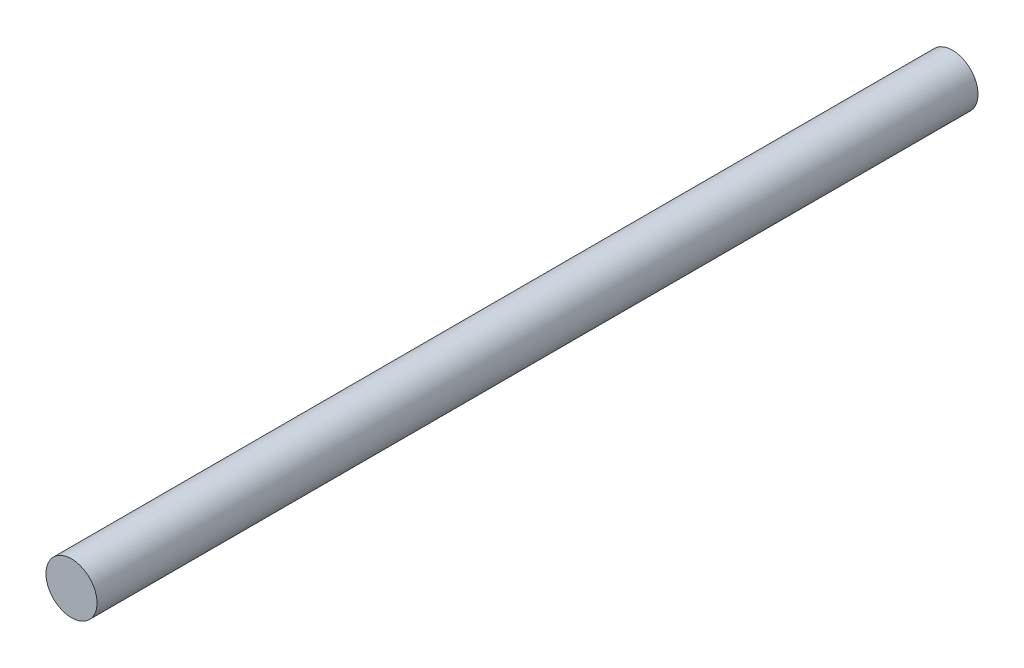
ISO-10303-21;
HEADER;
FILE_DESCRIPTION(('STEP AP214'),'2;1');
FILE_NAME('part.step','',(''),(''),'','','');
FILE_SCHEMA(('AUTOMOTIVE_DESIGN { 1 0 10303 214 1 1 1 1 }'));
ENDSEC;
DATA;
#1=APPLICATION_CONTEXT('core data for automotive mechanical design processes');
#2=APPLICATION_PROTOCOL_DEFINITION('international standard','automotive_design',2000,#1);
#3=PRODUCT_CONTEXT('',#1,'mechanical');
#4=PRODUCT('Part','Part','',(#3));
#5=PRODUCT_RELATED_PRODUCT_CATEGORY('part','',(#4));
#6=PRODUCT_DEFINITION_FORMATION('','',#4);
#7=PRODUCT_DEFINITION_CONTEXT('part definition',#1,'design');
#8=PRODUCT_DEFINITION('design','',#6,#7);
#9=PRODUCT_DEFINITION_SHAPE('','',#8);
#10=(LENGTH_UNIT() NAMED_UNIT(*) SI_UNIT(.MILLI.,.METRE.));
#11=(NAMED_UNIT(*) PLANE_ANGLE_UNIT() SI_UNIT($,.RADIAN.));
#12=(NAMED_UNIT(*) SI_UNIT($,.STERADIAN.) SOLID_ANGLE_UNIT());
#13=UNCERTAINTY_MEASURE_WITH_UNIT(LENGTH_MEASURE(1.E-05),#10,'distance_accuracy_value','');
#14=(GEOMETRIC_REPRESENTATION_CONTEXT(3) GLOBAL_UNCERTAINTY_ASSIGNED_CONTEXT((#13)) GLOBAL_UNIT_ASSIGNED_CONTEXT((#10,
#11,#12)) REPRESENTATION_CONTEXT('',''));
#15=CARTESIAN_POINT('',(0.,0.,0.));
#16=DIRECTION('',(0.,0.,1.));
#17=DIRECTION('',(1.,0.,0.));
#18=AXIS2_PLACEMENT_3D('',#15,#16,#17);
#19=CARTESIAN_POINT('',(0.,0.,138.));
#20=DIRECTION('',(0.,0.,-1.));
#21=DIRECTION('',(-1.,0.,0.));
#22=AXIS2_PLACEMENT_3D('',#19,#20,#21);
#23=CYLINDRICAL_SURFACE('',#22,4.);
#24=CARTESIAN_POINT('',(0.,0.,138.));
#25=DIRECTION('',(0.,0.,1.));
#26=DIRECTION('',(1.,0.,0.));
#27=AXIS2_PLACEMENT_3D('',#24,#25,#26);
#28=CIRCLE('',#27,4.);
#29=CARTESIAN_POINT('',(4.,0.,138.));
#30=VERTEX_POINT('',#29);
#31=EDGE_CURVE('E10',#30,#30,#28,.T.);
#32=ORIENTED_EDGE('',*,*,#31,.F.);
#33=EDGE_LOOP('',(#32));
#34=FACE_BOUND('',#33,.T.);
#35=CARTESIAN_POINT('',(0.,0.,0.));
#36=DIRECTION('',(0.,0.,1.));
#37=DIRECTION('',(1.,0.,0.));
#38=AXIS2_PLACEMENT_3D('',#35,#36,#37);
#39=CIRCLE('',#38,4.);
#40=CARTESIAN_POINT('',(4.,0.,0.));
#41=VERTEX_POINT('',#40);
#42=EDGE_CURVE('E34',#41,#41,#39,.T.);
#43=ORIENTED_EDGE('',*,*,#42,.T.);
#44=EDGE_LOOP('',(#43));
#45=FACE_BOUND('',#44,.T.);
#46=ADVANCED_FACE('F31',(#34,#45),#23,.T.);
#47=CARTESIAN_POINT('',(0.,0.,138.));
#48=DIRECTION('',(0.,0.,1.));
#49=DIRECTION('',(1.,0.,0.));
#50=AXIS2_PLACEMENT_3D('',#47,#48,#49);
#51=PLANE('',#50);
#52=ORIENTED_EDGE('',*,*,#31,.T.);
#53=EDGE_LOOP('',(#52));
#54=FACE_BOUND('',#53,.T.);
#55=ADVANCED_FACE('F46',(#54),#51,.T.);
#56=CARTESIAN_POINT('',(0.,0.,0.));
#57=DIRECTION('',(0.,0.,1.));
#58=DIRECTION('',(1.,0.,0.));
#59=AXIS2_PLACEMENT_3D('',#56,#57,#58);
#60=PLANE('',#59);
#61=ORIENTED_EDGE('',*,*,#42,.F.);
#62=EDGE_LOOP('',(#61));
#63=FACE_BOUND('',#62,.T.);
#64=ADVANCED_FACE('F44',(#63),#60,.F.);
#65=CLOSED_SHELL('',(#46,#55,#64));
#66=MANIFOLD_SOLID_BREP('B2',#65);
#67=ADVANCED_BREP_SHAPE_REPRESENTATION('',(#18,#66),#14);
#68=SHAPE_DEFINITION_REPRESENTATION(#9,#67);
ENDSEC;
END-ISO-10303-21;
